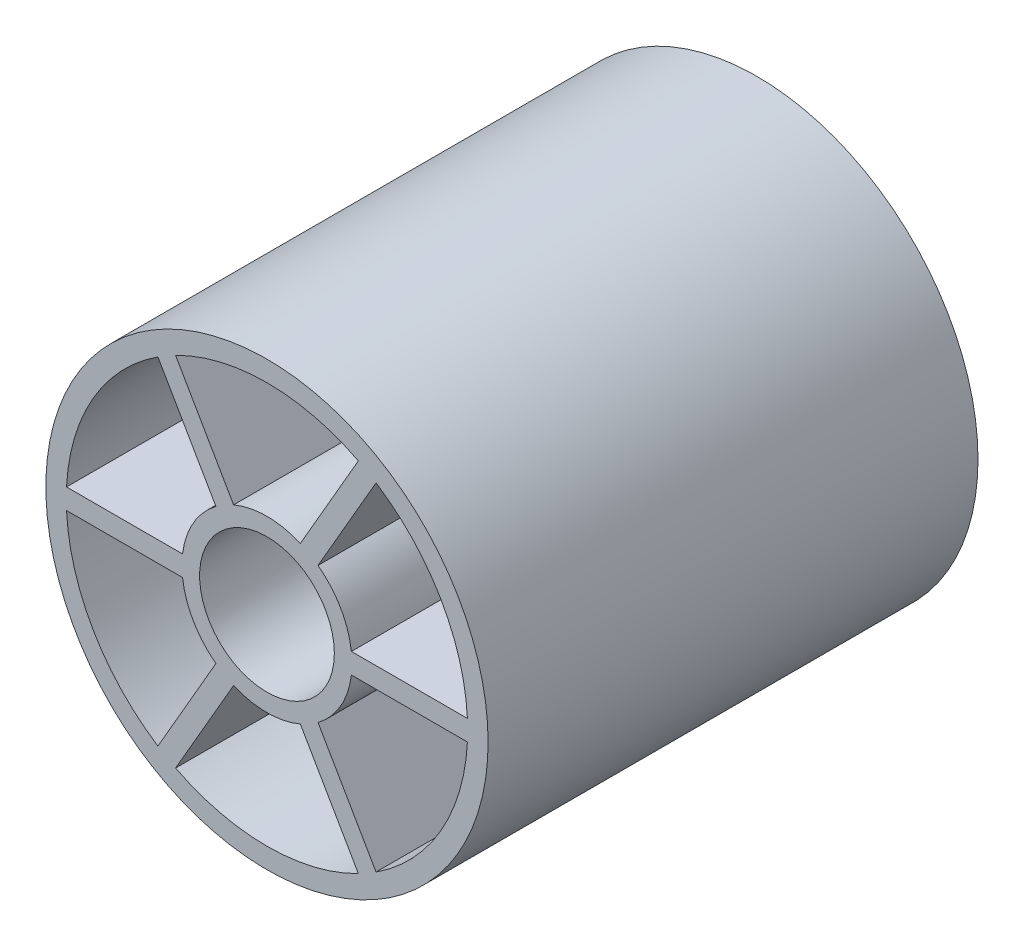
ISO-10303-21;
HEADER;
FILE_DESCRIPTION(('STEP AP214'),'2;1');
FILE_NAME('part.step','',(''),(''),'','','');
FILE_SCHEMA(('AUTOMOTIVE_DESIGN { 1 0 10303 214 1 1 1 1 }'));
ENDSEC;
DATA;
#1=APPLICATION_CONTEXT('core data for automotive mechanical design processes');
#2=APPLICATION_PROTOCOL_DEFINITION('international standard','automotive_design',2000,#1);
#3=PRODUCT_CONTEXT('',#1,'mechanical');
#4=PRODUCT('Part','Part','',(#3));
#5=PRODUCT_RELATED_PRODUCT_CATEGORY('part','',(#4));
#6=PRODUCT_DEFINITION_FORMATION('','',#4);
#7=PRODUCT_DEFINITION_CONTEXT('part definition',#1,'design');
#8=PRODUCT_DEFINITION('design','',#6,#7);
#9=PRODUCT_DEFINITION_SHAPE('','',#8);
#10=(LENGTH_UNIT() NAMED_UNIT(*) SI_UNIT(.MILLI.,.METRE.));
#11=(NAMED_UNIT(*) PLANE_ANGLE_UNIT() SI_UNIT($,.RADIAN.));
#12=(NAMED_UNIT(*) SI_UNIT($,.STERADIAN.) SOLID_ANGLE_UNIT());
#13=UNCERTAINTY_MEASURE_WITH_UNIT(LENGTH_MEASURE(1.E-05),#10,'distance_accuracy_value','');
#14=(GEOMETRIC_REPRESENTATION_CONTEXT(3) GLOBAL_UNCERTAINTY_ASSIGNED_CONTEXT((#13)) GLOBAL_UNIT_ASSIGNED_CONTEXT((#10,
#11,#12)) REPRESENTATION_CONTEXT('',''));
#15=CARTESIAN_POINT('',(0.,0.,0.));
#16=DIRECTION('',(0.,0.,1.));
#17=DIRECTION('',(1.,0.,0.));
#18=AXIS2_PLACEMENT_3D('',#15,#16,#17);
#19=CARTESIAN_POINT('',(-29.4618397253125,-1.5,72.));
#20=DIRECTION('',(0.,1.,0.));
#21=DIRECTION('',(0.,0.,1.));
#22=AXIS2_PLACEMENT_3D('',#19,#20,#21);
#23=PLANE('',#22);
#24=DIRECTION('',(0.,0.,-1.));
#25=VECTOR('',#24,1.);
#26=CARTESIAN_POINT('',(-12.4096736459909,-1.5,72.));
#27=LINE('',#26,#25);
#28=CARTESIAN_POINT('',(-12.4096736459909,-1.5,72.));
#29=VERTEX_POINT('',#28);
#30=CARTESIAN_POINT('',(-12.4096736459909,-1.5,0.));
#31=VERTEX_POINT('',#30);
#32=EDGE_CURVE('E458',#29,#31,#27,.T.);
#33=ORIENTED_EDGE('',*,*,#32,.F.);
#34=DIRECTION('',(1.,0.,0.));
#35=VECTOR('',#34,1.);
#36=CARTESIAN_POINT('',(-29.4618397253125,-1.5,72.));
#37=LINE('',#36,#35);
#38=CARTESIAN_POINT('',(-29.4618397253125,-1.5,72.));
#39=VERTEX_POINT('',#38);
#40=EDGE_CURVE('E378',#39,#29,#37,.T.);
#41=ORIENTED_EDGE('',*,*,#40,.F.);
#42=DIRECTION('',(0.,0.,-1.));
#43=VECTOR('',#42,1.);
#44=CARTESIAN_POINT('',(-29.4618397253125,-1.5,72.));
#45=LINE('',#44,#43);
#46=CARTESIAN_POINT('',(-29.4618397253125,-1.5,0.));
#47=VERTEX_POINT('',#46);
#48=EDGE_CURVE('E402',#39,#47,#45,.T.);
#49=ORIENTED_EDGE('',*,*,#48,.T.);
#50=DIRECTION('',(1.,0.,0.));
#51=VECTOR('',#50,1.);
#52=CARTESIAN_POINT('',(-29.4618397253125,-1.5,0.));
#53=LINE('',#52,#51);
#54=EDGE_CURVE('E57',#47,#31,#53,.T.);
#55=ORIENTED_EDGE('',*,*,#54,.T.);
#56=EDGE_LOOP('',(#33,#41,#49,#55));
#57=FACE_BOUND('',#56,.T.);
#58=ADVANCED_FACE('F41',(#57),#23,.F.);
#59=DIRECTION('',(0.,0.,-1.));
#60=VECTOR('',#59,1.);
#61=CARTESIAN_POINT('',(12.4096736459909,-1.5,72.));
#62=LINE('',#61,#60);
#63=CARTESIAN_POINT('',(12.4096736459909,-1.5,0.));
#64=VERTEX_POINT('',#63);
#65=CARTESIAN_POINT('',(12.4096736459909,-1.5,72.));
#66=VERTEX_POINT('',#65);
#67=EDGE_CURVE('E65',#64,#66,#62,.F.);
#68=ORIENTED_EDGE('',*,*,#67,.F.);
#69=CARTESIAN_POINT('',(29.4618397253125,-1.5,0.));
#70=VERTEX_POINT('',#69);
#71=EDGE_CURVE('E377',#64,#70,#53,.T.);
#72=ORIENTED_EDGE('',*,*,#71,.T.);
#73=DIRECTION('',(0.,0.,-1.));
#74=VECTOR('',#73,1.);
#75=CARTESIAN_POINT('',(29.4618397253125,-1.5,72.));
#76=LINE('',#75,#74);
#77=CARTESIAN_POINT('',(29.4618397253125,-1.5,72.));
#78=VERTEX_POINT('',#77);
#79=EDGE_CURVE('E398',#78,#70,#76,.T.);
#80=ORIENTED_EDGE('',*,*,#79,.F.);
#81=EDGE_CURVE('E382',#66,#78,#37,.T.);
#82=ORIENTED_EDGE('',*,*,#81,.F.);
#83=EDGE_LOOP('',(#68,#72,#80,#82));
#84=FACE_BOUND('',#83,.T.);
#85=ADVANCED_FACE('F448',(#84),#23,.F.);
#86=CARTESIAN_POINT('',(-29.4618397253125,1.5,72.));
#87=DIRECTION('',(0.,-1.,0.));
#88=DIRECTION('',(0.,0.,-1.));
#89=AXIS2_PLACEMENT_3D('',#86,#87,#88);
#90=PLANE('',#89);
#91=DIRECTION('',(0.,0.,-1.));
#92=VECTOR('',#91,1.);
#93=CARTESIAN_POINT('',(12.4096736459909,1.5,72.));
#94=LINE('',#93,#92);
#95=CARTESIAN_POINT('',(12.4096736459909,1.5,72.));
#96=VERTEX_POINT('',#95);
#97=CARTESIAN_POINT('',(12.4096736459909,1.5,0.));
#98=VERTEX_POINT('',#97);
#99=EDGE_CURVE('E232',#96,#98,#94,.T.);
#100=ORIENTED_EDGE('',*,*,#99,.F.);
#101=DIRECTION('',(-1.,0.,0.));
#102=VECTOR('',#101,1.);
#103=CARTESIAN_POINT('',(-29.4618397253125,1.5,72.));
#104=LINE('',#103,#102);
#105=CARTESIAN_POINT('',(29.4618397253125,1.5,72.));
#106=VERTEX_POINT('',#105);
#107=EDGE_CURVE('E383',#106,#96,#104,.T.);
#108=ORIENTED_EDGE('',*,*,#107,.F.);
#109=DIRECTION('',(0.,0.,-1.));
#110=VECTOR('',#109,1.);
#111=CARTESIAN_POINT('',(29.4618397253125,1.5,72.));
#112=LINE('',#111,#110);
#113=CARTESIAN_POINT('',(29.4618397253125,1.5,0.));
#114=VERTEX_POINT('',#113);
#115=EDGE_CURVE('E395',#106,#114,#112,.T.);
#116=ORIENTED_EDGE('',*,*,#115,.T.);
#117=DIRECTION('',(-1.,0.,0.));
#118=VECTOR('',#117,1.);
#119=CARTESIAN_POINT('',(-29.4618397253125,1.5,0.));
#120=LINE('',#119,#118);
#121=EDGE_CURVE('E389',#114,#98,#120,.T.);
#122=ORIENTED_EDGE('',*,*,#121,.T.);
#123=EDGE_LOOP('',(#100,#108,#116,#122));
#124=FACE_BOUND('',#123,.T.);
#125=ADVANCED_FACE('F520',(#124),#90,.F.);
#126=DIRECTION('',(0.,0.,-1.));
#127=VECTOR('',#126,1.);
#128=CARTESIAN_POINT('',(-12.4096736459909,1.5,72.));
#129=LINE('',#128,#127);
#130=CARTESIAN_POINT('',(-12.4096736459909,1.5,0.));
#131=VERTEX_POINT('',#130);
#132=CARTESIAN_POINT('',(-12.4096736459909,1.5,72.));
#133=VERTEX_POINT('',#132);
#134=EDGE_CURVE('E462',#131,#133,#129,.F.);
#135=ORIENTED_EDGE('',*,*,#134,.F.);
#136=CARTESIAN_POINT('',(-29.4618397253125,1.5,0.));
#137=VERTEX_POINT('',#136);
#138=EDGE_CURVE('E388',#131,#137,#120,.T.);
#139=ORIENTED_EDGE('',*,*,#138,.T.);
#140=DIRECTION('',(0.,0.,-1.));
#141=VECTOR('',#140,1.);
#142=CARTESIAN_POINT('',(-29.4618397253125,1.5,72.));
#143=LINE('',#142,#141);
#144=CARTESIAN_POINT('',(-29.4618397253125,1.5,72.));
#145=VERTEX_POINT('',#144);
#146=EDGE_CURVE('E386',#145,#137,#143,.T.);
#147=ORIENTED_EDGE('',*,*,#146,.F.);
#148=EDGE_CURVE('E381',#133,#145,#104,.T.);
#149=ORIENTED_EDGE('',*,*,#148,.F.);
#150=EDGE_LOOP('',(#135,#139,#147,#149));
#151=FACE_BOUND('',#150,.T.);
#152=ADVANCED_FACE('F489',(#151),#90,.F.);
#153=CARTESIAN_POINT('',(13.4318817569797,-26.2647016443461,72.));
#154=DIRECTION('',(0.866025403784436,0.500000000000004,0.));
#155=DIRECTION('',(-0.500000000000004,0.866025403784436,0.));
#156=AXIS2_PLACEMENT_3D('',#153,#154,#155);
#157=PLANE('',#156);
#158=DIRECTION('',(0.,0.,-1.));
#159=VECTOR('',#158,1.);
#160=CARTESIAN_POINT('',(-7.50387492867215,9.99709263010232,72.));
#161=LINE('',#160,#159);
#162=CARTESIAN_POINT('',(-7.50387492867215,9.99709263010233,72.));
#163=VERTEX_POINT('',#162);
#164=CARTESIAN_POINT('',(-7.50387492867215,9.99709263010233,0.));
#165=VERTEX_POINT('',#164);
#166=EDGE_CURVE('E227',#163,#165,#161,.T.);
#167=ORIENTED_EDGE('',*,*,#166,.F.);
#168=DIRECTION('',(0.500000000000004,-0.866025403784436,0.));
#169=VECTOR('',#168,1.);
#170=CARTESIAN_POINT('',(13.4318817569797,-26.2647016443461,72.));
#171=LINE('',#170,#169);
#172=CARTESIAN_POINT('',(-16.029957968333,24.7647016443461,72.));
#173=VERTEX_POINT('',#172);
#174=EDGE_CURVE('E321',#173,#163,#171,.T.);
#175=ORIENTED_EDGE('',*,*,#174,.F.);
#176=DIRECTION('',(0.,0.,-1.));
#177=VECTOR('',#176,1.);
#178=CARTESIAN_POINT('',(-16.029957968333,24.7647016443461,72.));
#179=LINE('',#178,#177);
#180=CARTESIAN_POINT('',(-16.029957968333,24.7647016443461,0.));
#181=VERTEX_POINT('',#180);
#182=EDGE_CURVE('E341',#173,#181,#179,.T.);
#183=ORIENTED_EDGE('',*,*,#182,.T.);
#184=DIRECTION('',(0.500000000000004,-0.866025403784436,0.));
#185=VECTOR('',#184,1.);
#186=CARTESIAN_POINT('',(13.4318817569797,-26.2647016443461,0.));
#187=LINE('',#186,#185);
#188=EDGE_CURVE('E336',#181,#165,#187,.T.);
#189=ORIENTED_EDGE('',*,*,#188,.T.);
#190=EDGE_LOOP('',(#167,#175,#183,#189));
#191=FACE_BOUND('',#190,.T.);
#192=ADVANCED_FACE('F527',(#191),#157,.F.);
#193=CARTESIAN_POINT('',(-13.4318817569795,-26.2647016443462,72.));
#194=DIRECTION('',(-0.86602540378444,0.499999999999998,0.));
#195=DIRECTION('',(-0.499999999999998,-0.86602540378444,0.));
#196=AXIS2_PLACEMENT_3D('',#193,#194,#195);
#197=PLANE('',#196);
#198=DIRECTION('',(0.,0.,-1.));
#199=VECTOR('',#198,1.);
#200=CARTESIAN_POINT('',(7.50387492867207,9.99709263010237,72.));
#201=LINE('',#200,#199);
#202=CARTESIAN_POINT('',(7.50387492867208,9.99709263010238,0.));
#203=VERTEX_POINT('',#202);
#204=CARTESIAN_POINT('',(7.50387492867208,9.99709263010238,72.));
#205=VERTEX_POINT('',#204);
#206=EDGE_CURVE('E220',#203,#205,#201,.F.);
#207=ORIENTED_EDGE('',*,*,#206,.F.);
#208=DIRECTION('',(0.499999999999998,0.86602540378444,0.));
#209=VECTOR('',#208,1.);
#210=CARTESIAN_POINT('',(-13.4318817569795,-26.2647016443462,0.));
#211=LINE('',#210,#209);
#212=CARTESIAN_POINT('',(16.0299579683328,24.7647016443462,0.));
#213=VERTEX_POINT('',#212);
#214=EDGE_CURVE('E204',#203,#213,#211,.T.);
#215=ORIENTED_EDGE('',*,*,#214,.T.);
#216=DIRECTION('',(0.,0.,-1.));
#217=VECTOR('',#216,1.);
#218=CARTESIAN_POINT('',(16.0299579683328,24.7647016443462,72.));
#219=LINE('',#218,#217);
#220=CARTESIAN_POINT('',(16.0299579683328,24.7647016443462,72.));
#221=VERTEX_POINT('',#220);
#222=EDGE_CURVE('E371',#221,#213,#219,.T.);
#223=ORIENTED_EDGE('',*,*,#222,.F.);
#224=DIRECTION('',(0.499999999999998,0.86602540378444,0.));
#225=VECTOR('',#224,1.);
#226=CARTESIAN_POINT('',(-13.4318817569795,-26.2647016443462,72.));
#227=LINE('',#226,#225);
#228=EDGE_CURVE('E222',#205,#221,#227,.T.);
#229=ORIENTED_EDGE('',*,*,#228,.F.);
#230=EDGE_LOOP('',(#207,#215,#223,#229));
#231=FACE_BOUND('',#230,.T.);
#232=ADVANCED_FACE('F221',(#231),#197,.F.);
#233=CARTESIAN_POINT('',(16.029957968333,-24.7647016443461,72.));
#234=DIRECTION('',(-0.866025403784436,-0.500000000000004,0.));
#235=DIRECTION('',(0.500000000000004,-0.866025403784436,0.));
#236=AXIS2_PLACEMENT_3D('',#233,#234,#235);
#237=PLANE('',#236);
#238=DIRECTION('',(0.,0.,-1.));
#239=VECTOR('',#238,1.);
#240=CARTESIAN_POINT('',(-4.90579871731883,11.4970926301023,72.));
#241=LINE('',#240,#239);
#242=CARTESIAN_POINT('',(-4.90579871731884,11.4970926301023,0.));
#243=VERTEX_POINT('',#242);
#244=CARTESIAN_POINT('',(-4.90579871731884,11.4970926301023,72.));
#245=VERTEX_POINT('',#244);
#246=EDGE_CURVE('E228',#243,#245,#241,.F.);
#247=ORIENTED_EDGE('',*,*,#246,.F.);
#248=DIRECTION('',(-0.500000000000004,0.866025403784436,0.));
#249=VECTOR('',#248,1.);
#250=CARTESIAN_POINT('',(16.029957968333,-24.7647016443461,0.));
#251=LINE('',#250,#249);
#252=CARTESIAN_POINT('',(-13.4318817569797,26.2647016443461,0.));
#253=VERTEX_POINT('',#252);
#254=EDGE_CURVE('E335',#243,#253,#251,.T.);
#255=ORIENTED_EDGE('',*,*,#254,.T.);
#256=DIRECTION('',(0.,0.,-1.));
#257=VECTOR('',#256,1.);
#258=CARTESIAN_POINT('',(-13.4318817569797,26.2647016443461,72.));
#259=LINE('',#258,#257);
#260=CARTESIAN_POINT('',(-13.4318817569797,26.2647016443461,72.));
#261=VERTEX_POINT('',#260);
#262=EDGE_CURVE('E345',#261,#253,#259,.T.);
#263=ORIENTED_EDGE('',*,*,#262,.F.);
#264=DIRECTION('',(-0.500000000000004,0.866025403784436,0.));
#265=VECTOR('',#264,1.);
#266=CARTESIAN_POINT('',(16.029957968333,-24.7647016443461,72.));
#267=LINE('',#266,#265);
#268=EDGE_CURVE('E328',#245,#261,#267,.T.);
#269=ORIENTED_EDGE('',*,*,#268,.F.);
#270=EDGE_LOOP('',(#247,#255,#263,#269));
#271=FACE_BOUND('',#270,.T.);
#272=ADVANCED_FACE('F561',(#271),#237,.F.);
#273=CARTESIAN_POINT('',(-16.0299579683328,-24.7647016443462,72.));
#274=DIRECTION('',(0.86602540378444,-0.499999999999998,0.));
#275=DIRECTION('',(0.499999999999998,0.86602540378444,0.));
#276=AXIS2_PLACEMENT_3D('',#273,#274,#275);
#277=PLANE('',#276);
#278=DIRECTION('',(0.,0.,-1.));
#279=VECTOR('',#278,1.);
#280=CARTESIAN_POINT('',(4.90579871731876,11.4970926301024,72.));
#281=LINE('',#280,#279);
#282=CARTESIAN_POINT('',(4.90579871731876,11.4970926301024,72.));
#283=VERTEX_POINT('',#282);
#284=CARTESIAN_POINT('',(4.90579871731876,11.4970926301024,0.));
#285=VERTEX_POINT('',#284);
#286=EDGE_CURVE('E472',#283,#285,#281,.T.);
#287=ORIENTED_EDGE('',*,*,#286,.F.);
#288=DIRECTION('',(-0.499999999999998,-0.86602540378444,0.));
#289=VECTOR('',#288,1.);
#290=CARTESIAN_POINT('',(-16.0299579683328,-24.7647016443462,72.));
#291=LINE('',#290,#289);
#292=CARTESIAN_POINT('',(13.4318817569795,26.2647016443462,72.));
#293=VERTEX_POINT('',#292);
#294=EDGE_CURVE('E355',#293,#283,#291,.T.);
#295=ORIENTED_EDGE('',*,*,#294,.F.);
#296=DIRECTION('',(0.,0.,-1.));
#297=VECTOR('',#296,1.);
#298=CARTESIAN_POINT('',(13.4318817569795,26.2647016443462,72.));
#299=LINE('',#298,#297);
#300=CARTESIAN_POINT('',(13.4318817569795,26.2647016443462,0.));
#301=VERTEX_POINT('',#300);
#302=EDGE_CURVE('E367',#293,#301,#299,.T.);
#303=ORIENTED_EDGE('',*,*,#302,.T.);
#304=DIRECTION('',(-0.499999999999998,-0.86602540378444,0.));
#305=VECTOR('',#304,1.);
#306=CARTESIAN_POINT('',(-16.0299579683328,-24.7647016443462,0.));
#307=LINE('',#306,#305);
#308=EDGE_CURVE('E361',#301,#285,#307,.T.);
#309=ORIENTED_EDGE('',*,*,#308,.T.);
#310=EDGE_LOOP('',(#287,#295,#303,#309));
#311=FACE_BOUND('',#310,.T.);
#312=ADVANCED_FACE('F564',(#311),#277,.F.);
#313=DIRECTION('',(0.,0.,-1.));
#314=VECTOR('',#313,1.);
#315=CARTESIAN_POINT('',(-7.50387492867207,-9.99709263010238,72.));
#316=LINE('',#315,#314);
#317=CARTESIAN_POINT('',(-7.50387492867207,-9.99709263010238,0.));
#318=VERTEX_POINT('',#317);
#319=CARTESIAN_POINT('',(-7.50387492867207,-9.99709263010238,72.));
#320=VERTEX_POINT('',#319);
#321=EDGE_CURVE('E476',#318,#320,#316,.F.);
#322=ORIENTED_EDGE('',*,*,#321,.F.);
#323=CARTESIAN_POINT('',(-16.0299579683328,-24.7647016443462,0.));
#324=VERTEX_POINT('',#323);
#325=EDGE_CURVE('E360',#318,#324,#307,.T.);
#326=ORIENTED_EDGE('',*,*,#325,.T.);
#327=DIRECTION('',(0.,0.,-1.));
#328=VECTOR('',#327,1.);
#329=CARTESIAN_POINT('',(-16.0299579683328,-24.7647016443462,72.));
#330=LINE('',#329,#328);
#331=CARTESIAN_POINT('',(-16.0299579683328,-24.7647016443462,72.));
#332=VERTEX_POINT('',#331);
#333=EDGE_CURVE('E357',#332,#324,#330,.T.);
#334=ORIENTED_EDGE('',*,*,#333,.F.);
#335=EDGE_CURVE('E354',#320,#332,#291,.T.);
#336=ORIENTED_EDGE('',*,*,#335,.F.);
#337=EDGE_LOOP('',(#322,#326,#334,#336));
#338=FACE_BOUND('',#337,.T.);
#339=ADVANCED_FACE('F513',(#338),#277,.F.);
#340=DIRECTION('',(0.,0.,-1.));
#341=VECTOR('',#340,1.);
#342=CARTESIAN_POINT('',(7.50387492867215,-9.99709263010232,72.));
#343=LINE('',#342,#341);
#344=CARTESIAN_POINT('',(7.50387492867214,-9.99709263010232,72.));
#345=VERTEX_POINT('',#344);
#346=CARTESIAN_POINT('',(7.50387492867214,-9.99709263010232,0.));
#347=VERTEX_POINT('',#346);
#348=EDGE_CURVE('E280',#345,#347,#343,.T.);
#349=ORIENTED_EDGE('',*,*,#348,.F.);
#350=CARTESIAN_POINT('',(16.029957968333,-24.7647016443461,72.));
#351=VERTEX_POINT('',#350);
#352=EDGE_CURVE('E322',#351,#345,#267,.T.);
#353=ORIENTED_EDGE('',*,*,#352,.F.);
#354=DIRECTION('',(0.,0.,-1.));
#355=VECTOR('',#354,1.);
#356=CARTESIAN_POINT('',(16.029957968333,-24.7647016443461,72.));
#357=LINE('',#356,#355);
#358=CARTESIAN_POINT('',(16.029957968333,-24.7647016443461,0.));
#359=VERTEX_POINT('',#358);
#360=EDGE_CURVE('E217',#351,#359,#357,.T.);
#361=ORIENTED_EDGE('',*,*,#360,.T.);
#362=EDGE_CURVE('E332',#359,#347,#251,.T.);
#363=ORIENTED_EDGE('',*,*,#362,.T.);
#364=EDGE_LOOP('',(#349,#353,#361,#363));
#365=FACE_BOUND('',#364,.T.);
#366=ADVANCED_FACE('F454',(#365),#237,.F.);
#367=DIRECTION('',(0.,0.,-1.));
#368=VECTOR('',#367,1.);
#369=CARTESIAN_POINT('',(-4.90579871731876,-11.4970926301024,72.));
#370=LINE('',#369,#368);
#371=CARTESIAN_POINT('',(-4.90579871731876,-11.4970926301024,72.));
#372=VERTEX_POINT('',#371);
#373=CARTESIAN_POINT('',(-4.90579871731876,-11.4970926301024,0.));
#374=VERTEX_POINT('',#373);
#375=EDGE_CURVE('E272',#372,#374,#370,.T.);
#376=ORIENTED_EDGE('',*,*,#375,.F.);
#377=CARTESIAN_POINT('',(-13.4318817569795,-26.2647016443462,72.));
#378=VERTEX_POINT('',#377);
#379=EDGE_CURVE('E309',#378,#372,#227,.T.);
#380=ORIENTED_EDGE('',*,*,#379,.F.);
#381=DIRECTION('',(0.,0.,-1.));
#382=VECTOR('',#381,1.);
#383=CARTESIAN_POINT('',(-13.4318817569795,-26.2647016443462,72.));
#384=LINE('',#383,#382);
#385=CARTESIAN_POINT('',(-13.4318817569795,-26.2647016443462,0.));
#386=VERTEX_POINT('',#385);
#387=EDGE_CURVE('E374',#378,#386,#384,.T.);
#388=ORIENTED_EDGE('',*,*,#387,.T.);
#389=EDGE_CURVE('E216',#386,#374,#211,.T.);
#390=ORIENTED_EDGE('',*,*,#389,.T.);
#391=EDGE_LOOP('',(#376,#380,#388,#390));
#392=FACE_BOUND('',#391,.T.);
#393=ADVANCED_FACE('F569',(#392),#197,.F.);
#394=DIRECTION('',(0.,0.,-1.));
#395=VECTOR('',#394,1.);
#396=CARTESIAN_POINT('',(4.90579871731883,-11.4970926301023,72.));
#397=LINE('',#396,#395);
#398=CARTESIAN_POINT('',(4.90579871731883,-11.4970926301023,0.));
#399=VERTEX_POINT('',#398);
#400=CARTESIAN_POINT('',(4.90579871731883,-11.4970926301023,72.));
#401=VERTEX_POINT('',#400);
#402=EDGE_CURVE('E11',#399,#401,#397,.F.);
#403=ORIENTED_EDGE('',*,*,#402,.F.);
#404=CARTESIAN_POINT('',(13.4318817569797,-26.2647016443461,0.));
#405=VERTEX_POINT('',#404);
#406=EDGE_CURVE('E317',#399,#405,#187,.T.);
#407=ORIENTED_EDGE('',*,*,#406,.T.);
#408=DIRECTION('',(0.,0.,-1.));
#409=VECTOR('',#408,1.);
#410=CARTESIAN_POINT('',(13.4318817569797,-26.2647016443461,72.));
#411=LINE('',#410,#409);
#412=CARTESIAN_POINT('',(13.4318817569797,-26.2647016443461,72.));
#413=VERTEX_POINT('',#412);
#414=EDGE_CURVE('E319',#413,#405,#411,.T.);
#415=ORIENTED_EDGE('',*,*,#414,.F.);
#416=EDGE_CURVE('E306',#401,#413,#171,.T.);
#417=ORIENTED_EDGE('',*,*,#416,.F.);
#418=EDGE_LOOP('',(#403,#407,#415,#417));
#419=FACE_BOUND('',#418,.T.);
#420=ADVANCED_FACE('F315',(#419),#157,.F.);
#421=CARTESIAN_POINT('',(0.,0.,163.923881554251));
#422=DIRECTION('',(0.,0.,-1.));
#423=DIRECTION('',(-1.,0.,0.));
#424=AXIS2_PLACEMENT_3D('',#421,#422,#423);
#425=CYLINDRICAL_SURFACE('',#424,29.5);
#426=CARTESIAN_POINT('',(0.,0.,0.));
#427=DIRECTION('',(0.,0.,1.));
#428=DIRECTION('',(1.,0.,0.));
#429=AXIS2_PLACEMENT_3D('',#426,#427,#428);
#430=CIRCLE('',#429,29.5);
#431=EDGE_CURVE('E427',#386,#405,#430,.T.);
#432=ORIENTED_EDGE('',*,*,#431,.F.);
#433=ORIENTED_EDGE('',*,*,#387,.F.);
#434=CARTESIAN_POINT('',(0.,0.,72.));
#435=DIRECTION('',(0.,0.,1.));
#436=DIRECTION('',(1.,0.,0.));
#437=AXIS2_PLACEMENT_3D('',#434,#435,#436);
#438=CIRCLE('',#437,29.5);
#439=EDGE_CURVE('E431',#378,#413,#438,.T.);
#440=ORIENTED_EDGE('',*,*,#439,.T.);
#441=ORIENTED_EDGE('',*,*,#414,.T.);
#442=EDGE_LOOP('',(#432,#433,#440,#441));
#443=FACE_BOUND('',#442,.T.);
#444=ADVANCED_FACE('F537',(#443),#425,.F.);
#445=EDGE_CURVE('E422',#39,#332,#438,.T.);
#446=ORIENTED_EDGE('',*,*,#445,.T.);
#447=ORIENTED_EDGE('',*,*,#333,.T.);
#448=EDGE_CURVE('E414',#47,#324,#430,.T.);
#449=ORIENTED_EDGE('',*,*,#448,.F.);
#450=ORIENTED_EDGE('',*,*,#48,.F.);
#451=EDGE_LOOP('',(#446,#447,#449,#450));
#452=FACE_BOUND('',#451,.T.);
#453=ADVANCED_FACE('F539',(#452),#425,.F.);
#454=EDGE_CURVE('E419',#359,#70,#430,.T.);
#455=ORIENTED_EDGE('',*,*,#454,.F.);
#456=ORIENTED_EDGE('',*,*,#360,.F.);
#457=EDGE_CURVE('E405',#351,#78,#438,.T.);
#458=ORIENTED_EDGE('',*,*,#457,.T.);
#459=ORIENTED_EDGE('',*,*,#79,.T.);
#460=EDGE_LOOP('',(#455,#456,#458,#459));
#461=FACE_BOUND('',#460,.T.);
#462=ADVANCED_FACE('F445',(#461),#425,.F.);
#463=EDGE_CURVE('E417',#106,#221,#438,.T.);
#464=ORIENTED_EDGE('',*,*,#463,.T.);
#465=ORIENTED_EDGE('',*,*,#222,.T.);
#466=EDGE_CURVE('E211',#114,#213,#430,.T.);
#467=ORIENTED_EDGE('',*,*,#466,.F.);
#468=ORIENTED_EDGE('',*,*,#115,.F.);
#469=EDGE_LOOP('',(#464,#465,#467,#468));
#470=FACE_BOUND('',#469,.T.);
#471=ADVANCED_FACE('F518',(#470),#425,.F.);
#472=EDGE_CURVE('E412',#301,#253,#430,.T.);
#473=ORIENTED_EDGE('',*,*,#472,.F.);
#474=ORIENTED_EDGE('',*,*,#302,.F.);
#475=EDGE_CURVE('E420',#293,#261,#438,.T.);
#476=ORIENTED_EDGE('',*,*,#475,.T.);
#477=ORIENTED_EDGE('',*,*,#262,.T.);
#478=EDGE_LOOP('',(#473,#474,#476,#477));
#479=FACE_BOUND('',#478,.T.);
#480=ADVANCED_FACE('F628',(#479),#425,.F.);
#481=EDGE_CURVE('E413',#181,#137,#430,.T.);
#482=ORIENTED_EDGE('',*,*,#481,.F.);
#483=ORIENTED_EDGE('',*,*,#182,.F.);
#484=EDGE_CURVE('E421',#173,#145,#438,.T.);
#485=ORIENTED_EDGE('',*,*,#484,.T.);
#486=ORIENTED_EDGE('',*,*,#146,.T.);
#487=EDGE_LOOP('',(#482,#483,#485,#486));
#488=FACE_BOUND('',#487,.T.);
#489=ADVANCED_FACE('F497',(#488),#425,.F.);
#490=CARTESIAN_POINT('',(0.,0.,163.923881554251));
#491=DIRECTION('',(0.,0.,-1.));
#492=DIRECTION('',(-1.,0.,0.));
#493=AXIS2_PLACEMENT_3D('',#490,#491,#492);
#494=CYLINDRICAL_SURFACE('',#493,32.5);
#495=CARTESIAN_POINT('',(0.,0.,0.));
#496=DIRECTION('',(0.,0.,1.));
#497=DIRECTION('',(1.,0.,0.));
#498=AXIS2_PLACEMENT_3D('',#495,#496,#497);
#499=CIRCLE('',#498,32.5);
#500=CARTESIAN_POINT('',(32.5,0.,0.));
#501=VERTEX_POINT('',#500);
#502=EDGE_CURVE('E409',#501,#501,#499,.T.);
#503=ORIENTED_EDGE('',*,*,#502,.T.);
#504=EDGE_LOOP('',(#503));
#505=FACE_BOUND('',#504,.T.);
#506=CARTESIAN_POINT('',(0.,0.,72.));
#507=DIRECTION('',(0.,0.,1.));
#508=DIRECTION('',(1.,0.,0.));
#509=AXIS2_PLACEMENT_3D('',#506,#507,#508);
#510=CIRCLE('',#509,32.5);
#511=CARTESIAN_POINT('',(32.5,0.,72.));
#512=VERTEX_POINT('',#511);
#513=EDGE_CURVE('E50',#512,#512,#510,.T.);
#514=ORIENTED_EDGE('',*,*,#513,.F.);
#515=EDGE_LOOP('',(#514));
#516=FACE_BOUND('',#515,.T.);
#517=ADVANCED_FACE('F43',(#505,#516),#494,.T.);
#518=CARTESIAN_POINT('',(0.,0.,0.));
#519=DIRECTION('',(0.,0.,1.));
#520=DIRECTION('',(1.,0.,0.));
#521=AXIS2_PLACEMENT_3D('',#518,#519,#520);
#522=PLANE('',#521);
#523=CARTESIAN_POINT('',(0.,0.,0.));
#524=DIRECTION('',(0.,0.,1.));
#525=DIRECTION('',(1.,0.,0.));
#526=AXIS2_PLACEMENT_3D('',#523,#524,#525);
#527=CIRCLE('',#526,9.90000000000002);
#528=CARTESIAN_POINT('',(9.90000000000002,0.,0.));
#529=VERTEX_POINT('',#528);
#530=EDGE_CURVE('E262',#529,#529,#527,.T.);
#531=ORIENTED_EDGE('',*,*,#530,.T.);
#532=EDGE_LOOP('',(#531));
#533=FACE_BOUND('',#532,.T.);
#534=ORIENTED_EDGE('',*,*,#71,.F.);
#535=CARTESIAN_POINT('',(0.,0.,0.));
#536=DIRECTION('',(0.,0.,1.));
#537=DIRECTION('',(1.,0.,0.));
#538=AXIS2_PLACEMENT_3D('',#535,#536,#537);
#539=CIRCLE('',#538,12.5);
#540=EDGE_CURVE('E237',#347,#64,#539,.T.);
#541=ORIENTED_EDGE('',*,*,#540,.F.);
#542=ORIENTED_EDGE('',*,*,#362,.F.);
#543=ORIENTED_EDGE('',*,*,#454,.T.);
#544=EDGE_LOOP('',(#534,#541,#542,#543));
#545=FACE_BOUND('',#544,.T.);
#546=ORIENTED_EDGE('',*,*,#138,.F.);
#547=EDGE_CURVE('E247',#165,#131,#539,.T.);
#548=ORIENTED_EDGE('',*,*,#547,.F.);
#549=ORIENTED_EDGE('',*,*,#188,.F.);
#550=ORIENTED_EDGE('',*,*,#481,.T.);
#551=EDGE_LOOP('',(#546,#548,#549,#550));
#552=FACE_BOUND('',#551,.T.);
#553=ORIENTED_EDGE('',*,*,#406,.F.);
#554=EDGE_CURVE('E251',#374,#399,#539,.T.);
#555=ORIENTED_EDGE('',*,*,#554,.F.);
#556=ORIENTED_EDGE('',*,*,#389,.F.);
#557=ORIENTED_EDGE('',*,*,#431,.T.);
#558=EDGE_LOOP('',(#553,#555,#556,#557));
#559=FACE_BOUND('',#558,.T.);
#560=ORIENTED_EDGE('',*,*,#325,.F.);
#561=EDGE_CURVE('E259',#31,#318,#539,.T.);
#562=ORIENTED_EDGE('',*,*,#561,.F.);
#563=ORIENTED_EDGE('',*,*,#54,.F.);
#564=ORIENTED_EDGE('',*,*,#448,.T.);
#565=EDGE_LOOP('',(#560,#562,#563,#564));
#566=FACE_BOUND('',#565,.T.);
#567=ORIENTED_EDGE('',*,*,#254,.F.);
#568=EDGE_CURVE('E235',#285,#243,#539,.T.);
#569=ORIENTED_EDGE('',*,*,#568,.F.);
#570=ORIENTED_EDGE('',*,*,#308,.F.);
#571=ORIENTED_EDGE('',*,*,#472,.T.);
#572=EDGE_LOOP('',(#567,#569,#570,#571));
#573=FACE_BOUND('',#572,.T.);
#574=ORIENTED_EDGE('',*,*,#214,.F.);
#575=EDGE_CURVE('E210',#98,#203,#539,.T.);
#576=ORIENTED_EDGE('',*,*,#575,.F.);
#577=ORIENTED_EDGE('',*,*,#121,.F.);
#578=ORIENTED_EDGE('',*,*,#466,.T.);
#579=EDGE_LOOP('',(#574,#576,#577,#578));
#580=FACE_BOUND('',#579,.T.);
#581=ORIENTED_EDGE('',*,*,#502,.F.);
#582=EDGE_LOOP('',(#581));
#583=FACE_BOUND('',#582,.T.);
#584=ADVANCED_FACE('F206',(#533,#545,#552,#559,#566,#573,#580,#583),#522,.F.);
#585=CARTESIAN_POINT('',(0.,0.,72.));
#586=DIRECTION('',(0.,0.,1.));
#587=DIRECTION('',(1.,0.,0.));
#588=AXIS2_PLACEMENT_3D('',#585,#586,#587);
#589=PLANE('',#588);
#590=CARTESIAN_POINT('',(0.,0.,72.));
#591=DIRECTION('',(0.,0.,1.));
#592=DIRECTION('',(1.,0.,0.));
#593=AXIS2_PLACEMENT_3D('',#590,#591,#592);
#594=CIRCLE('',#593,9.90000000000002);
#595=CARTESIAN_POINT('',(9.90000000000002,0.,72.));
#596=VERTEX_POINT('',#595);
#597=EDGE_CURVE('E252',#596,#596,#594,.T.);
#598=ORIENTED_EDGE('',*,*,#597,.F.);
#599=EDGE_LOOP('',(#598));
#600=FACE_BOUND('',#599,.T.);
#601=CARTESIAN_POINT('',(0.,0.,72.));
#602=DIRECTION('',(0.,0.,1.));
#603=DIRECTION('',(1.,0.,0.));
#604=AXIS2_PLACEMENT_3D('',#601,#602,#603);
#605=CIRCLE('',#604,12.5);
#606=EDGE_CURVE('E234',#345,#66,#605,.T.);
#607=ORIENTED_EDGE('',*,*,#606,.T.);
#608=ORIENTED_EDGE('',*,*,#81,.T.);
#609=ORIENTED_EDGE('',*,*,#457,.F.);
#610=ORIENTED_EDGE('',*,*,#352,.T.);
#611=EDGE_LOOP('',(#607,#608,#609,#610));
#612=FACE_BOUND('',#611,.T.);
#613=EDGE_CURVE('E282',#163,#133,#605,.T.);
#614=ORIENTED_EDGE('',*,*,#613,.T.);
#615=ORIENTED_EDGE('',*,*,#148,.T.);
#616=ORIENTED_EDGE('',*,*,#484,.F.);
#617=ORIENTED_EDGE('',*,*,#174,.T.);
#618=EDGE_LOOP('',(#614,#615,#616,#617));
#619=FACE_BOUND('',#618,.T.);
#620=EDGE_CURVE('E242',#372,#401,#605,.T.);
#621=ORIENTED_EDGE('',*,*,#620,.T.);
#622=ORIENTED_EDGE('',*,*,#416,.T.);
#623=ORIENTED_EDGE('',*,*,#439,.F.);
#624=ORIENTED_EDGE('',*,*,#379,.T.);
#625=EDGE_LOOP('',(#621,#622,#623,#624));
#626=FACE_BOUND('',#625,.T.);
#627=EDGE_CURVE('E288',#29,#320,#605,.T.);
#628=ORIENTED_EDGE('',*,*,#627,.T.);
#629=ORIENTED_EDGE('',*,*,#335,.T.);
#630=ORIENTED_EDGE('',*,*,#445,.F.);
#631=ORIENTED_EDGE('',*,*,#40,.T.);
#632=EDGE_LOOP('',(#628,#629,#630,#631));
#633=FACE_BOUND('',#632,.T.);
#634=EDGE_CURVE('E273',#283,#245,#605,.T.);
#635=ORIENTED_EDGE('',*,*,#634,.T.);
#636=ORIENTED_EDGE('',*,*,#268,.T.);
#637=ORIENTED_EDGE('',*,*,#475,.F.);
#638=ORIENTED_EDGE('',*,*,#294,.T.);
#639=EDGE_LOOP('',(#635,#636,#637,#638));
#640=FACE_BOUND('',#639,.T.);
#641=EDGE_CURVE('E244',#96,#205,#605,.T.);
#642=ORIENTED_EDGE('',*,*,#641,.T.);
#643=ORIENTED_EDGE('',*,*,#228,.T.);
#644=ORIENTED_EDGE('',*,*,#463,.F.);
#645=ORIENTED_EDGE('',*,*,#107,.T.);
#646=EDGE_LOOP('',(#642,#643,#644,#645));
#647=FACE_BOUND('',#646,.T.);
#648=ORIENTED_EDGE('',*,*,#513,.T.);
#649=EDGE_LOOP('',(#648));
#650=FACE_BOUND('',#649,.T.);
#651=ADVANCED_FACE('F305',(#600,#612,#619,#626,#633,#640,#647,#650),#589,.T.);
#652=CARTESIAN_POINT('',(0.,0.,72.));
#653=DIRECTION('',(0.,0.,-1.));
#654=DIRECTION('',(-1.,0.,0.));
#655=AXIS2_PLACEMENT_3D('',#652,#653,#654);
#656=CYLINDRICAL_SURFACE('',#655,12.5);
#657=ORIENTED_EDGE('',*,*,#620,.F.);
#658=ORIENTED_EDGE('',*,*,#375,.T.);
#659=ORIENTED_EDGE('',*,*,#554,.T.);
#660=ORIENTED_EDGE('',*,*,#402,.T.);
#661=EDGE_LOOP('',(#657,#658,#659,#660));
#662=FACE_BOUND('',#661,.T.);
#663=ADVANCED_FACE('F311',(#662),#656,.T.);
#664=ORIENTED_EDGE('',*,*,#540,.T.);
#665=ORIENTED_EDGE('',*,*,#67,.T.);
#666=ORIENTED_EDGE('',*,*,#606,.F.);
#667=ORIENTED_EDGE('',*,*,#348,.T.);
#668=EDGE_LOOP('',(#664,#665,#666,#667));
#669=FACE_BOUND('',#668,.T.);
#670=ADVANCED_FACE('F456',(#669),#656,.T.);
#671=ORIENTED_EDGE('',*,*,#627,.F.);
#672=ORIENTED_EDGE('',*,*,#32,.T.);
#673=ORIENTED_EDGE('',*,*,#561,.T.);
#674=ORIENTED_EDGE('',*,*,#321,.T.);
#675=EDGE_LOOP('',(#671,#672,#673,#674));
#676=FACE_BOUND('',#675,.T.);
#677=ADVANCED_FACE('F507',(#676),#656,.T.);
#678=ORIENTED_EDGE('',*,*,#568,.T.);
#679=ORIENTED_EDGE('',*,*,#246,.T.);
#680=ORIENTED_EDGE('',*,*,#634,.F.);
#681=ORIENTED_EDGE('',*,*,#286,.T.);
#682=EDGE_LOOP('',(#678,#679,#680,#681));
#683=FACE_BOUND('',#682,.T.);
#684=ADVANCED_FACE('F555',(#683),#656,.T.);
#685=ORIENTED_EDGE('',*,*,#641,.F.);
#686=ORIENTED_EDGE('',*,*,#99,.T.);
#687=ORIENTED_EDGE('',*,*,#575,.T.);
#688=ORIENTED_EDGE('',*,*,#206,.T.);
#689=EDGE_LOOP('',(#685,#686,#687,#688));
#690=FACE_BOUND('',#689,.T.);
#691=ADVANCED_FACE('F231',(#690),#656,.T.);
#692=ORIENTED_EDGE('',*,*,#547,.T.);
#693=ORIENTED_EDGE('',*,*,#134,.T.);
#694=ORIENTED_EDGE('',*,*,#613,.F.);
#695=ORIENTED_EDGE('',*,*,#166,.T.);
#696=EDGE_LOOP('',(#692,#693,#694,#695));
#697=FACE_BOUND('',#696,.T.);
#698=ADVANCED_FACE('F500',(#697),#656,.T.);
#699=CARTESIAN_POINT('',(0.,0.,72.));
#700=DIRECTION('',(0.,0.,-1.));
#701=DIRECTION('',(-1.,0.,0.));
#702=AXIS2_PLACEMENT_3D('',#699,#700,#701);
#703=CYLINDRICAL_SURFACE('',#702,9.90000000000002);
#704=ORIENTED_EDGE('',*,*,#597,.T.);
#705=EDGE_LOOP('',(#704));
#706=FACE_BOUND('',#705,.T.);
#707=ORIENTED_EDGE('',*,*,#530,.F.);
#708=EDGE_LOOP('',(#707));
#709=FACE_BOUND('',#708,.T.);
#710=ADVANCED_FACE('F548',(#706,#709),#703,.F.);
#711=CLOSED_SHELL('',(#58,#85,#125,#152,#192,#232,#272,#312,#339,#366,#393,#420,#444,#453,#462,
#471,#480,#489,#517,#584,#651,#663,#670,#677,#684,#691,#698,#710));
#712=MANIFOLD_SOLID_BREP('B2',#711);
#713=ADVANCED_BREP_SHAPE_REPRESENTATION('',(#18,#712),#14);
#714=SHAPE_DEFINITION_REPRESENTATION(#9,#713);
ENDSEC;
END-ISO-10303-21;
